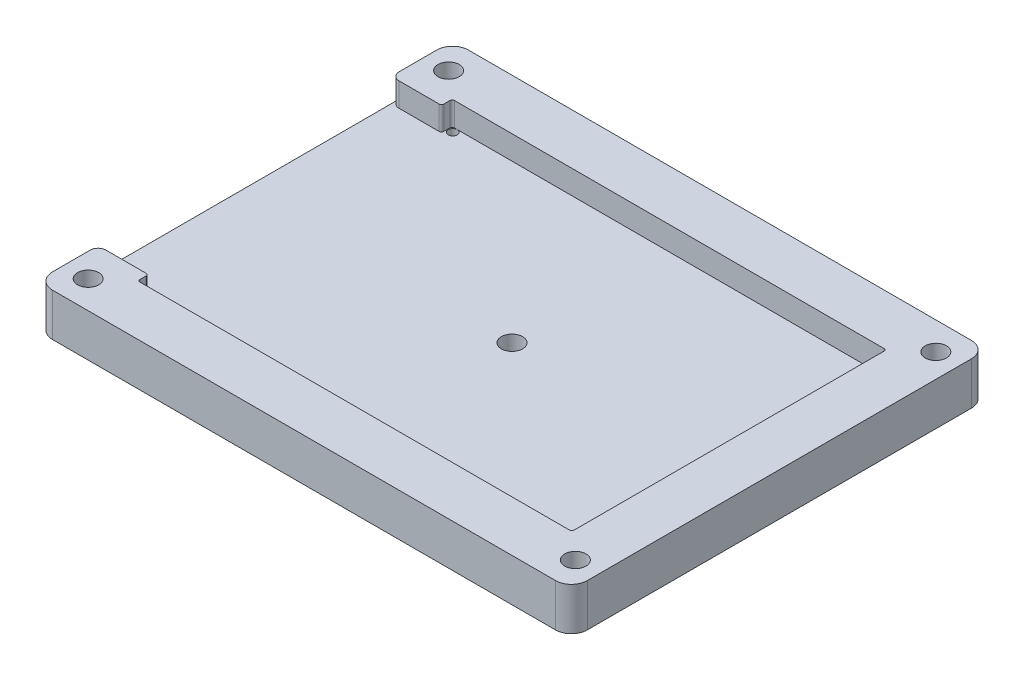
ISO-10303-21;
HEADER;
FILE_DESCRIPTION(('STEP AP214'),'2;1');
FILE_NAME('part.step','',(''),(''),'','','');
FILE_SCHEMA(('AUTOMOTIVE_DESIGN { 1 0 10303 214 1 1 1 1 }'));
ENDSEC;
DATA;
#1=APPLICATION_CONTEXT('core data for automotive mechanical design processes');
#2=APPLICATION_PROTOCOL_DEFINITION('international standard','automotive_design',2000,#1);
#3=PRODUCT_CONTEXT('',#1,'mechanical');
#4=PRODUCT('Part','Part','',(#3));
#5=PRODUCT_RELATED_PRODUCT_CATEGORY('part','',(#4));
#6=PRODUCT_DEFINITION_FORMATION('','',#4);
#7=PRODUCT_DEFINITION_CONTEXT('part definition',#1,'design');
#8=PRODUCT_DEFINITION('design','',#6,#7);
#9=PRODUCT_DEFINITION_SHAPE('','',#8);
#10=(LENGTH_UNIT() NAMED_UNIT(*) SI_UNIT(.MILLI.,.METRE.));
#11=(NAMED_UNIT(*) PLANE_ANGLE_UNIT() SI_UNIT($,.RADIAN.));
#12=(NAMED_UNIT(*) SI_UNIT($,.STERADIAN.) SOLID_ANGLE_UNIT());
#13=UNCERTAINTY_MEASURE_WITH_UNIT(LENGTH_MEASURE(1.E-05),#10,'distance_accuracy_value','');
#14=(GEOMETRIC_REPRESENTATION_CONTEXT(3) GLOBAL_UNCERTAINTY_ASSIGNED_CONTEXT((#13)) GLOBAL_UNIT_ASSIGNED_CONTEXT((#10,
#11,#12)) REPRESENTATION_CONTEXT('',''));
#15=CARTESIAN_POINT('',(0.,0.,0.));
#16=DIRECTION('',(0.,0.,1.));
#17=DIRECTION('',(1.,0.,0.));
#18=AXIS2_PLACEMENT_3D('',#15,#16,#17);
#19=CARTESIAN_POINT('',(-34.798,3.048,25.2095));
#20=DIRECTION('',(-1.,0.,0.));
#21=DIRECTION('',(0.,0.,1.));
#22=AXIS2_PLACEMENT_3D('',#19,#20,#21);
#23=PLANE('',#22);
#24=DIRECTION('',(0.,0.,1.));
#25=VECTOR('',#24,1.);
#26=CARTESIAN_POINT('',(-34.798,6.858,25.2095));
#27=LINE('',#26,#25);
#28=CARTESIAN_POINT('',(-34.798,6.858,-24.8285));
#29=VERTEX_POINT('',#28);
#30=CARTESIAN_POINT('',(-34.798,6.858,-23.876));
#31=VERTEX_POINT('',#30);
#32=EDGE_CURVE('E375',#29,#31,#27,.T.);
#33=ORIENTED_EDGE('',*,*,#32,.T.);
#34=DIRECTION('',(0.,-1.,0.));
#35=VECTOR('',#34,1.);
#36=CARTESIAN_POINT('',(-34.798,3.048,-23.876));
#37=LINE('',#36,#35);
#38=CARTESIAN_POINT('',(-34.798,3.048,-23.876));
#39=VERTEX_POINT('',#38);
#40=EDGE_CURVE('E316',#31,#39,#37,.T.);
#41=ORIENTED_EDGE('',*,*,#40,.T.);
#42=DIRECTION('',(0.,0.,1.));
#43=VECTOR('',#42,1.);
#44=CARTESIAN_POINT('',(-34.798,3.048,25.2095));
#45=LINE('',#44,#43);
#46=CARTESIAN_POINT('',(-34.798,3.048,-24.8285));
#47=VERTEX_POINT('',#46);
#48=EDGE_CURVE('E384',#47,#39,#45,.T.);
#49=ORIENTED_EDGE('',*,*,#48,.F.);
#50=DIRECTION('',(0.,1.,0.));
#51=VECTOR('',#50,1.);
#52=CARTESIAN_POINT('',(-34.798,6.858,-24.8285));
#53=LINE('',#52,#51);
#54=EDGE_CURVE('E291',#47,#29,#53,.T.);
#55=ORIENTED_EDGE('',*,*,#54,.T.);
#56=EDGE_LOOP('',(#33,#41,#49,#55));
#57=FACE_BOUND('',#56,.T.);
#58=ADVANCED_FACE('F37',(#57),#23,.F.);
#59=CARTESIAN_POINT('',(42.8625,6.858,33.3375));
#60=DIRECTION('',(-1.,0.,0.));
#61=DIRECTION('',(0.,0.,1.));
#62=AXIS2_PLACEMENT_3D('',#59,#60,#61);
#63=PLANE('',#62);
#64=DIRECTION('',(0.,0.,-1.));
#65=VECTOR('',#64,1.);
#66=CARTESIAN_POINT('',(42.8625,6.858,33.3375));
#67=LINE('',#66,#65);
#68=CARTESIAN_POINT('',(42.8625,6.858,30.7975));
#69=VERTEX_POINT('',#68);
#70=CARTESIAN_POINT('',(42.8625,6.858,-30.7975));
#71=VERTEX_POINT('',#70);
#72=EDGE_CURVE('E218',#69,#71,#67,.T.);
#73=ORIENTED_EDGE('',*,*,#72,.F.);
#74=DIRECTION('',(0.,-1.,0.));
#75=VECTOR('',#74,1.);
#76=CARTESIAN_POINT('',(42.8625,6.858,30.7975));
#77=LINE('',#76,#75);
#78=CARTESIAN_POINT('',(42.8625,0.,30.7975));
#79=VERTEX_POINT('',#78);
#80=EDGE_CURVE('E202',#69,#79,#77,.T.);
#81=ORIENTED_EDGE('',*,*,#80,.T.);
#82=DIRECTION('',(0.,0.,-1.));
#83=VECTOR('',#82,1.);
#84=CARTESIAN_POINT('',(42.8625,0.,33.3375));
#85=LINE('',#84,#83);
#86=CARTESIAN_POINT('',(42.8625,0.,-30.7975));
#87=VERTEX_POINT('',#86);
#88=EDGE_CURVE('E215',#79,#87,#85,.T.);
#89=ORIENTED_EDGE('',*,*,#88,.T.);
#90=DIRECTION('',(0.,-1.,0.));
#91=VECTOR('',#90,1.);
#92=CARTESIAN_POINT('',(42.8625,6.858,-30.7975));
#93=LINE('',#92,#91);
#94=EDGE_CURVE('E220',#87,#71,#93,.F.);
#95=ORIENTED_EDGE('',*,*,#94,.T.);
#96=EDGE_LOOP('',(#73,#81,#89,#95));
#97=FACE_BOUND('',#96,.T.);
#98=ADVANCED_FACE('F214',(#97),#63,.F.);
#99=CARTESIAN_POINT('',(-42.8625,6.858,-33.3375));
#100=DIRECTION('',(0.,0.,1.));
#101=DIRECTION('',(1.,0.,0.));
#102=AXIS2_PLACEMENT_3D('',#99,#100,#101);
#103=PLANE('',#102);
#104=DIRECTION('',(-1.,0.,0.));
#105=VECTOR('',#104,1.);
#106=CARTESIAN_POINT('',(-42.8625,0.,-33.3375));
#107=LINE('',#106,#105);
#108=CARTESIAN_POINT('',(40.3225,0.,-33.3375));
#109=VERTEX_POINT('',#108);
#110=CARTESIAN_POINT('',(-40.3225,0.,-33.3375));
#111=VERTEX_POINT('',#110);
#112=EDGE_CURVE('E225',#109,#111,#107,.T.);
#113=ORIENTED_EDGE('',*,*,#112,.T.);
#114=DIRECTION('',(0.,-1.,0.));
#115=VECTOR('',#114,1.);
#116=CARTESIAN_POINT('',(-40.3225,6.858,-33.3375));
#117=LINE('',#116,#115);
#118=CARTESIAN_POINT('',(-40.3225,6.858,-33.3375));
#119=VERTEX_POINT('',#118);
#120=EDGE_CURVE('E266',#111,#119,#117,.F.);
#121=ORIENTED_EDGE('',*,*,#120,.T.);
#122=DIRECTION('',(-1.,0.,0.));
#123=VECTOR('',#122,1.);
#124=CARTESIAN_POINT('',(-42.8625,6.858,-33.3375));
#125=LINE('',#124,#123);
#126=CARTESIAN_POINT('',(40.3225,6.858,-33.3375));
#127=VERTEX_POINT('',#126);
#128=EDGE_CURVE('E361',#127,#119,#125,.T.);
#129=ORIENTED_EDGE('',*,*,#128,.F.);
#130=DIRECTION('',(0.,-1.,0.));
#131=VECTOR('',#130,1.);
#132=CARTESIAN_POINT('',(40.3225,6.858,-33.3375));
#133=LINE('',#132,#131);
#134=EDGE_CURVE('E263',#127,#109,#133,.T.);
#135=ORIENTED_EDGE('',*,*,#134,.T.);
#136=EDGE_LOOP('',(#113,#121,#129,#135));
#137=FACE_BOUND('',#136,.T.);
#138=ADVANCED_FACE('F518',(#137),#103,.F.);
#139=CARTESIAN_POINT('',(-42.8625,6.858,33.3375));
#140=DIRECTION('',(1.,0.,0.));
#141=DIRECTION('',(0.,0.,-1.));
#142=AXIS2_PLACEMENT_3D('',#139,#140,#141);
#143=PLANE('',#142);
#144=DIRECTION('',(0.,0.,1.));
#145=VECTOR('',#144,1.);
#146=CARTESIAN_POINT('',(-42.8625,3.048,33.3375));
#147=LINE('',#146,#145);
#148=CARTESIAN_POINT('',(-42.8625,3.048,-24.765));
#149=VERTEX_POINT('',#148);
#150=CARTESIAN_POINT('',(-42.8625,3.048,24.765));
#151=VERTEX_POINT('',#150);
#152=EDGE_CURVE('E344',#149,#151,#147,.T.);
#153=ORIENTED_EDGE('',*,*,#152,.F.);
#154=DIRECTION('',(0.,1.,0.));
#155=VECTOR('',#154,1.);
#156=CARTESIAN_POINT('',(-42.8625,6.858,-24.765));
#157=LINE('',#156,#155);
#158=CARTESIAN_POINT('',(-42.8625,6.858,-24.765));
#159=VERTEX_POINT('',#158);
#160=EDGE_CURVE('E329',#149,#159,#157,.T.);
#161=ORIENTED_EDGE('',*,*,#160,.T.);
#162=DIRECTION('',(0.,0.,1.));
#163=VECTOR('',#162,1.);
#164=CARTESIAN_POINT('',(-42.8625,6.858,33.3375));
#165=LINE('',#164,#163);
#166=CARTESIAN_POINT('',(-42.8625,6.858,-30.7975));
#167=VERTEX_POINT('',#166);
#168=EDGE_CURVE('E352',#167,#159,#165,.T.);
#169=ORIENTED_EDGE('',*,*,#168,.F.);
#170=DIRECTION('',(0.,-1.,0.));
#171=VECTOR('',#170,1.);
#172=CARTESIAN_POINT('',(-42.8625,6.858,-30.7975));
#173=LINE('',#172,#171);
#174=CARTESIAN_POINT('',(-42.8625,0.,-30.7975));
#175=VERTEX_POINT('',#174);
#176=EDGE_CURVE('E260',#167,#175,#173,.T.);
#177=ORIENTED_EDGE('',*,*,#176,.T.);
#178=DIRECTION('',(0.,0.,1.));
#179=VECTOR('',#178,1.);
#180=CARTESIAN_POINT('',(-42.8625,0.,33.3375));
#181=LINE('',#180,#179);
#182=CARTESIAN_POINT('',(-42.8625,0.,30.7975));
#183=VERTEX_POINT('',#182);
#184=EDGE_CURVE('E229',#175,#183,#181,.T.);
#185=ORIENTED_EDGE('',*,*,#184,.T.);
#186=DIRECTION('',(0.,-1.,0.));
#187=VECTOR('',#186,1.);
#188=CARTESIAN_POINT('',(-42.8625,6.858,30.7975));
#189=LINE('',#188,#187);
#190=CARTESIAN_POINT('',(-42.8625,6.858,30.7975));
#191=VERTEX_POINT('',#190);
#192=EDGE_CURVE('E257',#183,#191,#189,.F.);
#193=ORIENTED_EDGE('',*,*,#192,.T.);
#194=CARTESIAN_POINT('',(-42.8625,6.858,24.765));
#195=VERTEX_POINT('',#194);
#196=EDGE_CURVE('E359',#195,#191,#165,.T.);
#197=ORIENTED_EDGE('',*,*,#196,.F.);
#198=DIRECTION('',(0.,-1.,0.));
#199=VECTOR('',#198,1.);
#200=CARTESIAN_POINT('',(-42.8625,6.858,24.765));
#201=LINE('',#200,#199);
#202=EDGE_CURVE('E326',#195,#151,#201,.T.);
#203=ORIENTED_EDGE('',*,*,#202,.T.);
#204=EDGE_LOOP('',(#153,#161,#169,#177,#185,#193,#197,#203));
#205=FACE_BOUND('',#204,.T.);
#206=ADVANCED_FACE('F351',(#205),#143,.F.);
#207=CARTESIAN_POINT('',(-42.8625,6.858,33.3375));
#208=DIRECTION('',(0.,0.,-1.));
#209=DIRECTION('',(-1.,0.,0.));
#210=AXIS2_PLACEMENT_3D('',#207,#208,#209);
#211=PLANE('',#210);
#212=DIRECTION('',(1.,0.,0.));
#213=VECTOR('',#212,1.);
#214=CARTESIAN_POINT('',(-42.8625,0.,33.3375));
#215=LINE('',#214,#213);
#216=CARTESIAN_POINT('',(-40.3225,0.,33.3375));
#217=VERTEX_POINT('',#216);
#218=CARTESIAN_POINT('',(40.3225,0.,33.3375));
#219=VERTEX_POINT('',#218);
#220=EDGE_CURVE('E240',#217,#219,#215,.T.);
#221=ORIENTED_EDGE('',*,*,#220,.T.);
#222=DIRECTION('',(0.,-1.,0.));
#223=VECTOR('',#222,1.);
#224=CARTESIAN_POINT('',(40.3225,6.858,33.3375));
#225=LINE('',#224,#223);
#226=CARTESIAN_POINT('',(40.3225,6.858,33.3375));
#227=VERTEX_POINT('',#226);
#228=EDGE_CURVE('E203',#219,#227,#225,.F.);
#229=ORIENTED_EDGE('',*,*,#228,.T.);
#230=DIRECTION('',(1.,0.,0.));
#231=VECTOR('',#230,1.);
#232=CARTESIAN_POINT('',(-42.8625,6.858,33.3375));
#233=LINE('',#232,#231);
#234=CARTESIAN_POINT('',(-40.3225,6.858,33.3375));
#235=VERTEX_POINT('',#234);
#236=EDGE_CURVE('E235',#235,#227,#233,.T.);
#237=ORIENTED_EDGE('',*,*,#236,.F.);
#238=DIRECTION('',(0.,-1.,0.));
#239=VECTOR('',#238,1.);
#240=CARTESIAN_POINT('',(-40.3225,6.858,33.3375));
#241=LINE('',#240,#239);
#242=EDGE_CURVE('E208',#235,#217,#241,.T.);
#243=ORIENTED_EDGE('',*,*,#242,.T.);
#244=EDGE_LOOP('',(#221,#229,#237,#243));
#245=FACE_BOUND('',#244,.T.);
#246=ADVANCED_FACE('F511',(#245),#211,.F.);
#247=CARTESIAN_POINT('',(0.,6.858,0.));
#248=DIRECTION('',(0.,-1.,0.));
#249=DIRECTION('',(0.,0.,-1.));
#250=AXIS2_PLACEMENT_3D('',#247,#248,#249);
#251=PLANE('',#250);
#252=CARTESIAN_POINT('',(39.0525,6.858,-28.8925));
#253=DIRECTION('',(0.,-1.,0.));
#254=DIRECTION('',(0.,0.,-1.));
#255=AXIS2_PLACEMENT_3D('',#252,#253,#254);
#256=CIRCLE('',#255,1.7);
#257=CARTESIAN_POINT('',(39.0525,6.858,-30.5925));
#258=VERTEX_POINT('',#257);
#259=EDGE_CURVE('E434',#258,#258,#256,.T.);
#260=ORIENTED_EDGE('',*,*,#259,.T.);
#261=EDGE_LOOP('',(#260));
#262=FACE_BOUND('',#261,.T.);
#263=CARTESIAN_POINT('',(-39.0525,6.858,-28.8925));
#264=DIRECTION('',(0.,-1.,0.));
#265=DIRECTION('',(0.,0.,-1.));
#266=AXIS2_PLACEMENT_3D('',#263,#264,#265);
#267=CIRCLE('',#266,1.7);
#268=CARTESIAN_POINT('',(-39.0525,6.858,-30.5925));
#269=VERTEX_POINT('',#268);
#270=EDGE_CURVE('E422',#269,#269,#267,.T.);
#271=ORIENTED_EDGE('',*,*,#270,.T.);
#272=EDGE_LOOP('',(#271));
#273=FACE_BOUND('',#272,.T.);
#274=CARTESIAN_POINT('',(39.0525,6.858,28.8925));
#275=DIRECTION('',(0.,-1.,0.));
#276=DIRECTION('',(0.,0.,-1.));
#277=AXIS2_PLACEMENT_3D('',#274,#275,#276);
#278=CIRCLE('',#277,1.7);
#279=CARTESIAN_POINT('',(39.0525,6.858,27.1925));
#280=VERTEX_POINT('',#279);
#281=EDGE_CURVE('E416',#280,#280,#278,.T.);
#282=ORIENTED_EDGE('',*,*,#281,.T.);
#283=EDGE_LOOP('',(#282));
#284=FACE_BOUND('',#283,.T.);
#285=CARTESIAN_POINT('',(-39.0525,6.858,28.8925));
#286=DIRECTION('',(0.,-1.,0.));
#287=DIRECTION('',(0.,0.,-1.));
#288=AXIS2_PLACEMENT_3D('',#285,#286,#287);
#289=CIRCLE('',#288,1.7);
#290=CARTESIAN_POINT('',(-39.0525,6.858,27.1925));
#291=VERTEX_POINT('',#290);
#292=EDGE_CURVE('E406',#291,#291,#289,.T.);
#293=ORIENTED_EDGE('',*,*,#292,.T.);
#294=EDGE_LOOP('',(#293));
#295=FACE_BOUND('',#294,.T.);
#296=ORIENTED_EDGE('',*,*,#168,.T.);
#297=CARTESIAN_POINT('',(-41.5925,6.858,-24.765));
#298=DIRECTION('',(0.,-1.,0.));
#299=DIRECTION('',(0.,0.,-1.));
#300=AXIS2_PLACEMENT_3D('',#297,#298,#299);
#301=CIRCLE('',#300,1.27);
#302=CARTESIAN_POINT('',(-41.5925,6.858,-23.495));
#303=VERTEX_POINT('',#302);
#304=EDGE_CURVE('E334',#159,#303,#301,.F.);
#305=ORIENTED_EDGE('',*,*,#304,.T.);
#306=DIRECTION('',(-1.,0.,0.));
#307=VECTOR('',#306,1.);
#308=CARTESIAN_POINT('',(-66.0615819385217,6.858,-23.495));
#309=LINE('',#308,#307);
#310=CARTESIAN_POINT('',(-35.179,6.858,-23.495));
#311=VERTEX_POINT('',#310);
#312=EDGE_CURVE('E443',#311,#303,#309,.T.);
#313=ORIENTED_EDGE('',*,*,#312,.F.);
#314=CARTESIAN_POINT('',(-35.179,6.858,-23.876));
#315=DIRECTION('',(0.,-1.,0.));
#316=DIRECTION('',(0.,0.,-1.));
#317=AXIS2_PLACEMENT_3D('',#314,#315,#316);
#318=CIRCLE('',#317,0.381);
#319=EDGE_CURVE('E309',#311,#31,#318,.F.);
#320=ORIENTED_EDGE('',*,*,#319,.T.);
#321=ORIENTED_EDGE('',*,*,#32,.F.);
#322=CARTESIAN_POINT('',(-34.417,6.858,-24.8285));
#323=DIRECTION('',(0.,-1.,0.));
#324=DIRECTION('',(0.,0.,-1.));
#325=AXIS2_PLACEMENT_3D('',#322,#323,#324);
#326=CIRCLE('',#325,0.381);
#327=CARTESIAN_POINT('',(-34.417,6.858,-25.2095));
#328=VERTEX_POINT('',#327);
#329=EDGE_CURVE('E304',#29,#328,#326,.T.);
#330=ORIENTED_EDGE('',*,*,#329,.T.);
#331=DIRECTION('',(-1.,0.,0.));
#332=VECTOR('',#331,1.);
#333=CARTESIAN_POINT('',(34.798,6.858,-25.2095));
#334=LINE('',#333,#332);
#335=CARTESIAN_POINT('',(34.417,6.858,-25.2095));
#336=VERTEX_POINT('',#335);
#337=EDGE_CURVE('E365',#336,#328,#334,.T.);
#338=ORIENTED_EDGE('',*,*,#337,.F.);
#339=CARTESIAN_POINT('',(34.417,6.858,-24.8285));
#340=DIRECTION('',(0.,-1.,0.));
#341=DIRECTION('',(0.,0.,-1.));
#342=AXIS2_PLACEMENT_3D('',#339,#340,#341);
#343=CIRCLE('',#342,0.381);
#344=CARTESIAN_POINT('',(34.798,6.858,-24.8285));
#345=VERTEX_POINT('',#344);
#346=EDGE_CURVE('E299',#336,#345,#343,.T.);
#347=ORIENTED_EDGE('',*,*,#346,.T.);
#348=DIRECTION('',(0.,0.,-1.));
#349=VECTOR('',#348,1.);
#350=CARTESIAN_POINT('',(34.798,6.858,25.2095));
#351=LINE('',#350,#349);
#352=CARTESIAN_POINT('',(34.798,6.858,24.8285));
#353=VERTEX_POINT('',#352);
#354=EDGE_CURVE('E369',#353,#345,#351,.T.);
#355=ORIENTED_EDGE('',*,*,#354,.F.);
#356=CARTESIAN_POINT('',(34.417,6.858,24.8285));
#357=DIRECTION('',(0.,-1.,0.));
#358=DIRECTION('',(0.,0.,-1.));
#359=AXIS2_PLACEMENT_3D('',#356,#357,#358);
#360=CIRCLE('',#359,0.381);
#361=CARTESIAN_POINT('',(34.417,6.858,25.2095));
#362=VERTEX_POINT('',#361);
#363=EDGE_CURVE('E297',#353,#362,#360,.T.);
#364=ORIENTED_EDGE('',*,*,#363,.T.);
#365=DIRECTION('',(1.,0.,0.));
#366=VECTOR('',#365,1.);
#367=CARTESIAN_POINT('',(34.798,6.858,25.2095));
#368=LINE('',#367,#366);
#369=CARTESIAN_POINT('',(-34.417,6.858,25.2095));
#370=VERTEX_POINT('',#369);
#371=EDGE_CURVE('E372',#370,#362,#368,.T.);
#372=ORIENTED_EDGE('',*,*,#371,.F.);
#373=CARTESIAN_POINT('',(-34.417,6.858,24.8285));
#374=DIRECTION('',(0.,-1.,0.));
#375=DIRECTION('',(0.,0.,-1.));
#376=AXIS2_PLACEMENT_3D('',#373,#374,#375);
#377=CIRCLE('',#376,0.381);
#378=CARTESIAN_POINT('',(-34.798,6.858,24.8285));
#379=VERTEX_POINT('',#378);
#380=EDGE_CURVE('E301',#370,#379,#377,.T.);
#381=ORIENTED_EDGE('',*,*,#380,.T.);
#382=CARTESIAN_POINT('',(-34.798,6.858,23.876));
#383=VERTEX_POINT('',#382);
#384=EDGE_CURVE('E377',#383,#379,#27,.T.);
#385=ORIENTED_EDGE('',*,*,#384,.F.);
#386=CARTESIAN_POINT('',(-35.179,6.858,23.876));
#387=DIRECTION('',(0.,-1.,0.));
#388=DIRECTION('',(0.,0.,-1.));
#389=AXIS2_PLACEMENT_3D('',#386,#387,#388);
#390=CIRCLE('',#389,0.381);
#391=CARTESIAN_POINT('',(-35.179,6.858,23.495));
#392=VERTEX_POINT('',#391);
#393=EDGE_CURVE('E311',#383,#392,#390,.F.);
#394=ORIENTED_EDGE('',*,*,#393,.T.);
#395=DIRECTION('',(1.,0.,0.));
#396=VECTOR('',#395,1.);
#397=CARTESIAN_POINT('',(-66.0615819385217,6.858,23.495));
#398=LINE('',#397,#396);
#399=CARTESIAN_POINT('',(-41.5925,6.858,23.495));
#400=VERTEX_POINT('',#399);
#401=EDGE_CURVE('E445',#400,#392,#398,.T.);
#402=ORIENTED_EDGE('',*,*,#401,.F.);
#403=CARTESIAN_POINT('',(-41.5925,6.858,24.765));
#404=DIRECTION('',(0.,-1.,0.));
#405=DIRECTION('',(0.,0.,-1.));
#406=AXIS2_PLACEMENT_3D('',#403,#404,#405);
#407=CIRCLE('',#406,1.27);
#408=EDGE_CURVE('E332',#400,#195,#407,.F.);
#409=ORIENTED_EDGE('',*,*,#408,.T.);
#410=ORIENTED_EDGE('',*,*,#196,.T.);
#411=CARTESIAN_POINT('',(-40.3225,6.858,30.7975));
#412=DIRECTION('',(0.,-1.,0.));
#413=DIRECTION('',(0.,0.,-1.));
#414=AXIS2_PLACEMENT_3D('',#411,#412,#413);
#415=CIRCLE('',#414,2.54);
#416=EDGE_CURVE('E249',#191,#235,#415,.F.);
#417=ORIENTED_EDGE('',*,*,#416,.T.);
#418=ORIENTED_EDGE('',*,*,#236,.T.);
#419=CARTESIAN_POINT('',(40.3225,6.858,30.7975));
#420=DIRECTION('',(0.,-1.,0.));
#421=DIRECTION('',(0.,0.,-1.));
#422=AXIS2_PLACEMENT_3D('',#419,#420,#421);
#423=CIRCLE('',#422,2.54);
#424=EDGE_CURVE('E255',#227,#69,#423,.F.);
#425=ORIENTED_EDGE('',*,*,#424,.T.);
#426=ORIENTED_EDGE('',*,*,#72,.T.);
#427=CARTESIAN_POINT('',(40.3225,6.858,-30.7975));
#428=DIRECTION('',(0.,-1.,0.));
#429=DIRECTION('',(0.,0.,-1.));
#430=AXIS2_PLACEMENT_3D('',#427,#428,#429);
#431=CIRCLE('',#430,2.54);
#432=EDGE_CURVE('E251',#71,#127,#431,.F.);
#433=ORIENTED_EDGE('',*,*,#432,.T.);
#434=ORIENTED_EDGE('',*,*,#128,.T.);
#435=CARTESIAN_POINT('',(-40.3225,6.858,-30.7975));
#436=DIRECTION('',(0.,-1.,0.));
#437=DIRECTION('',(0.,0.,-1.));
#438=AXIS2_PLACEMENT_3D('',#435,#436,#437);
#439=CIRCLE('',#438,2.54);
#440=EDGE_CURVE('E253',#119,#167,#439,.F.);
#441=ORIENTED_EDGE('',*,*,#440,.T.);
#442=EDGE_LOOP('',(#296,#305,#313,#320,#321,#330,#338,#347,#355,#364,#372,#381,#385,#394,#402,
#409,#410,#417,#418,#425,#426,#433,#434,#441));
#443=FACE_BOUND('',#442,.T.);
#444=ADVANCED_FACE('F355',(#262,#273,#284,#295,#443),#251,.F.);
#445=CARTESIAN_POINT('',(0.,0.,0.));
#446=DIRECTION('',(0.,-1.,0.));
#447=DIRECTION('',(0.,0.,-1.));
#448=AXIS2_PLACEMENT_3D('',#445,#446,#447);
#449=PLANE('',#448);
#450=CARTESIAN_POINT('',(39.0525,0.,-28.8925));
#451=DIRECTION('',(0.,-1.,0.));
#452=DIRECTION('',(0.,0.,-1.));
#453=AXIS2_PLACEMENT_3D('',#450,#451,#452);
#454=CIRCLE('',#453,1.7);
#455=CARTESIAN_POINT('',(39.0525,0.,-30.5925));
#456=VERTEX_POINT('',#455);
#457=EDGE_CURVE('E437',#456,#456,#454,.T.);
#458=ORIENTED_EDGE('',*,*,#457,.F.);
#459=EDGE_LOOP('',(#458));
#460=FACE_BOUND('',#459,.T.);
#461=CARTESIAN_POINT('',(0.,0.,0.));
#462=DIRECTION('',(0.,-1.,0.));
#463=DIRECTION('',(0.,0.,-1.));
#464=AXIS2_PLACEMENT_3D('',#461,#462,#463);
#465=CIRCLE('',#464,1.7);
#466=CARTESIAN_POINT('',(0.,0.,-1.7));
#467=VERTEX_POINT('',#466);
#468=EDGE_CURVE('E431',#467,#467,#465,.T.);
#469=ORIENTED_EDGE('',*,*,#468,.F.);
#470=EDGE_LOOP('',(#469));
#471=FACE_BOUND('',#470,.T.);
#472=CARTESIAN_POINT('',(-39.0525,0.,-28.8925));
#473=DIRECTION('',(0.,-1.,0.));
#474=DIRECTION('',(0.,0.,-1.));
#475=AXIS2_PLACEMENT_3D('',#472,#473,#474);
#476=CIRCLE('',#475,1.7);
#477=CARTESIAN_POINT('',(-39.0525,0.,-30.5925));
#478=VERTEX_POINT('',#477);
#479=EDGE_CURVE('E425',#478,#478,#476,.T.);
#480=ORIENTED_EDGE('',*,*,#479,.F.);
#481=EDGE_LOOP('',(#480));
#482=FACE_BOUND('',#481,.T.);
#483=CARTESIAN_POINT('',(39.0525,0.,28.8925));
#484=DIRECTION('',(0.,-1.,0.));
#485=DIRECTION('',(0.,0.,-1.));
#486=AXIS2_PLACEMENT_3D('',#483,#484,#485);
#487=CIRCLE('',#486,1.7);
#488=CARTESIAN_POINT('',(39.0525,0.,27.1925));
#489=VERTEX_POINT('',#488);
#490=EDGE_CURVE('E419',#489,#489,#487,.T.);
#491=ORIENTED_EDGE('',*,*,#490,.F.);
#492=EDGE_LOOP('',(#491));
#493=FACE_BOUND('',#492,.T.);
#494=CARTESIAN_POINT('',(-39.0525,0.,28.8925));
#495=DIRECTION('',(0.,-1.,0.));
#496=DIRECTION('',(0.,0.,-1.));
#497=AXIS2_PLACEMENT_3D('',#494,#495,#496);
#498=CIRCLE('',#497,1.7);
#499=CARTESIAN_POINT('',(-39.0525,0.,27.1925));
#500=VERTEX_POINT('',#499);
#501=EDGE_CURVE('E413',#500,#500,#498,.T.);
#502=ORIENTED_EDGE('',*,*,#501,.F.);
#503=EDGE_LOOP('',(#502));
#504=FACE_BOUND('',#503,.T.);
#505=CARTESIAN_POINT('',(-33.9725,0.,24.4729));
#506=DIRECTION('',(0.,-1.,0.));
#507=DIRECTION('',(0.,0.,-1.));
#508=AXIS2_PLACEMENT_3D('',#505,#506,#507);
#509=CIRCLE('',#508,0.723899999999999);
#510=CARTESIAN_POINT('',(-33.9725,0.,23.749));
#511=VERTEX_POINT('',#510);
#512=EDGE_CURVE('E386',#511,#511,#509,.T.);
#513=ORIENTED_EDGE('',*,*,#512,.F.);
#514=EDGE_LOOP('',(#513));
#515=FACE_BOUND('',#514,.T.);
#516=CARTESIAN_POINT('',(33.9725,0.,24.4729));
#517=DIRECTION('',(0.,-1.,0.));
#518=DIRECTION('',(0.,0.,-1.));
#519=AXIS2_PLACEMENT_3D('',#516,#517,#518);
#520=CIRCLE('',#519,0.723899999999999);
#521=CARTESIAN_POINT('',(33.9725,0.,23.749));
#522=VERTEX_POINT('',#521);
#523=EDGE_CURVE('E389',#522,#522,#520,.T.);
#524=ORIENTED_EDGE('',*,*,#523,.F.);
#525=EDGE_LOOP('',(#524));
#526=FACE_BOUND('',#525,.T.);
#527=CARTESIAN_POINT('',(33.9725,0.,-24.4729));
#528=DIRECTION('',(0.,-1.,0.));
#529=DIRECTION('',(0.,0.,-1.));
#530=AXIS2_PLACEMENT_3D('',#527,#528,#529);
#531=CIRCLE('',#530,0.723899999999999);
#532=CARTESIAN_POINT('',(33.9725,0.,-25.1968));
#533=VERTEX_POINT('',#532);
#534=EDGE_CURVE('E392',#533,#533,#531,.T.);
#535=ORIENTED_EDGE('',*,*,#534,.F.);
#536=EDGE_LOOP('',(#535));
#537=FACE_BOUND('',#536,.T.);
#538=CARTESIAN_POINT('',(-33.9725,0.,-24.4729));
#539=DIRECTION('',(0.,-1.,0.));
#540=DIRECTION('',(0.,0.,-1.));
#541=AXIS2_PLACEMENT_3D('',#538,#539,#540);
#542=CIRCLE('',#541,0.723899999999999);
#543=CARTESIAN_POINT('',(-33.9725,0.,-25.1968));
#544=VERTEX_POINT('',#543);
#545=EDGE_CURVE('E395',#544,#544,#542,.T.);
#546=ORIENTED_EDGE('',*,*,#545,.F.);
#547=EDGE_LOOP('',(#546));
#548=FACE_BOUND('',#547,.T.);
#549=ORIENTED_EDGE('',*,*,#88,.F.);
#550=CARTESIAN_POINT('',(40.3225,0.,30.7975));
#551=DIRECTION('',(0.,-1.,0.));
#552=DIRECTION('',(0.,0.,-1.));
#553=AXIS2_PLACEMENT_3D('',#550,#551,#552);
#554=CIRCLE('',#553,2.54);
#555=EDGE_CURVE('E198',#79,#219,#554,.T.);
#556=ORIENTED_EDGE('',*,*,#555,.T.);
#557=ORIENTED_EDGE('',*,*,#220,.F.);
#558=CARTESIAN_POINT('',(-40.3225,0.,30.7975));
#559=DIRECTION('',(0.,-1.,0.));
#560=DIRECTION('',(0.,0.,-1.));
#561=AXIS2_PLACEMENT_3D('',#558,#559,#560);
#562=CIRCLE('',#561,2.54);
#563=EDGE_CURVE('E219',#217,#183,#562,.T.);
#564=ORIENTED_EDGE('',*,*,#563,.T.);
#565=ORIENTED_EDGE('',*,*,#184,.F.);
#566=CARTESIAN_POINT('',(-40.3225,0.,-30.7975));
#567=DIRECTION('',(0.,-1.,0.));
#568=DIRECTION('',(0.,0.,-1.));
#569=AXIS2_PLACEMENT_3D('',#566,#567,#568);
#570=CIRCLE('',#569,2.54);
#571=EDGE_CURVE('E209',#175,#111,#570,.T.);
#572=ORIENTED_EDGE('',*,*,#571,.T.);
#573=ORIENTED_EDGE('',*,*,#112,.F.);
#574=CARTESIAN_POINT('',(40.3225,0.,-30.7975));
#575=DIRECTION('',(0.,-1.,0.));
#576=DIRECTION('',(0.,0.,-1.));
#577=AXIS2_PLACEMENT_3D('',#574,#575,#576);
#578=CIRCLE('',#577,2.54);
#579=EDGE_CURVE('E224',#109,#87,#578,.T.);
#580=ORIENTED_EDGE('',*,*,#579,.T.);
#581=EDGE_LOOP('',(#549,#556,#557,#564,#565,#572,#573,#580));
#582=FACE_BOUND('',#581,.T.);
#583=ADVANCED_FACE('F222',(#460,#471,#482,#493,#504,#515,#526,#537,#548,#582),#449,.T.);
#584=CARTESIAN_POINT('',(40.3225,6.858,30.7975));
#585=DIRECTION('',(0.,-1.,0.));
#586=DIRECTION('',(0.,0.,-1.));
#587=AXIS2_PLACEMENT_3D('',#584,#585,#586);
#588=CYLINDRICAL_SURFACE('',#587,2.54);
#589=ORIENTED_EDGE('',*,*,#424,.F.);
#590=ORIENTED_EDGE('',*,*,#228,.F.);
#591=ORIENTED_EDGE('',*,*,#555,.F.);
#592=ORIENTED_EDGE('',*,*,#80,.F.);
#593=EDGE_LOOP('',(#589,#590,#591,#592));
#594=FACE_BOUND('',#593,.T.);
#595=ADVANCED_FACE('F201',(#594),#588,.T.);
#596=CARTESIAN_POINT('',(-40.3225,6.858,-30.7975));
#597=DIRECTION('',(0.,-1.,0.));
#598=DIRECTION('',(0.,0.,-1.));
#599=AXIS2_PLACEMENT_3D('',#596,#597,#598);
#600=CYLINDRICAL_SURFACE('',#599,2.54);
#601=ORIENTED_EDGE('',*,*,#440,.F.);
#602=ORIENTED_EDGE('',*,*,#120,.F.);
#603=ORIENTED_EDGE('',*,*,#571,.F.);
#604=ORIENTED_EDGE('',*,*,#176,.F.);
#605=EDGE_LOOP('',(#601,#602,#603,#604));
#606=FACE_BOUND('',#605,.T.);
#607=ADVANCED_FACE('F515',(#606),#600,.T.);
#608=CARTESIAN_POINT('',(40.3225,6.858,-30.7975));
#609=DIRECTION('',(0.,-1.,0.));
#610=DIRECTION('',(0.,0.,-1.));
#611=AXIS2_PLACEMENT_3D('',#608,#609,#610);
#612=CYLINDRICAL_SURFACE('',#611,2.54);
#613=ORIENTED_EDGE('',*,*,#432,.F.);
#614=ORIENTED_EDGE('',*,*,#94,.F.);
#615=ORIENTED_EDGE('',*,*,#579,.F.);
#616=ORIENTED_EDGE('',*,*,#134,.F.);
#617=EDGE_LOOP('',(#613,#614,#615,#616));
#618=FACE_BOUND('',#617,.T.);
#619=ADVANCED_FACE('F523',(#618),#612,.T.);
#620=CARTESIAN_POINT('',(-40.3225,6.858,30.7975));
#621=DIRECTION('',(0.,-1.,0.));
#622=DIRECTION('',(0.,0.,-1.));
#623=AXIS2_PLACEMENT_3D('',#620,#621,#622);
#624=CYLINDRICAL_SURFACE('',#623,2.54);
#625=ORIENTED_EDGE('',*,*,#416,.F.);
#626=ORIENTED_EDGE('',*,*,#192,.F.);
#627=ORIENTED_EDGE('',*,*,#563,.F.);
#628=ORIENTED_EDGE('',*,*,#242,.F.);
#629=EDGE_LOOP('',(#625,#626,#627,#628));
#630=FACE_BOUND('',#629,.T.);
#631=ADVANCED_FACE('F512',(#630),#624,.T.);
#632=CARTESIAN_POINT('',(-34.798,3.048,23.876));
#633=VERTEX_POINT('',#632);
#634=CARTESIAN_POINT('',(-34.798,3.048,24.8285));
#635=VERTEX_POINT('',#634);
#636=EDGE_CURVE('E368',#633,#635,#45,.T.);
#637=ORIENTED_EDGE('',*,*,#636,.F.);
#638=DIRECTION('',(0.,1.,0.));
#639=VECTOR('',#638,1.);
#640=CARTESIAN_POINT('',(-34.798,3.048,23.876));
#641=LINE('',#640,#639);
#642=EDGE_CURVE('E306',#633,#383,#641,.T.);
#643=ORIENTED_EDGE('',*,*,#642,.T.);
#644=ORIENTED_EDGE('',*,*,#384,.T.);
#645=DIRECTION('',(0.,1.,0.));
#646=VECTOR('',#645,1.);
#647=CARTESIAN_POINT('',(-34.798,3.048,24.8285));
#648=LINE('',#647,#646);
#649=EDGE_CURVE('E294',#379,#635,#648,.F.);
#650=ORIENTED_EDGE('',*,*,#649,.T.);
#651=EDGE_LOOP('',(#637,#643,#644,#650));
#652=FACE_BOUND('',#651,.T.);
#653=ADVANCED_FACE('F493',(#652),#23,.F.);
#654=CARTESIAN_POINT('',(34.798,3.048,-25.2095));
#655=DIRECTION('',(0.,0.,-1.));
#656=DIRECTION('',(-1.,0.,0.));
#657=AXIS2_PLACEMENT_3D('',#654,#655,#656);
#658=PLANE('',#657);
#659=DIRECTION('',(-1.,0.,0.));
#660=VECTOR('',#659,1.);
#661=CARTESIAN_POINT('',(34.798,3.048,-25.2095));
#662=LINE('',#661,#660);
#663=CARTESIAN_POINT('',(34.417,3.048,-25.2095));
#664=VERTEX_POINT('',#663);
#665=CARTESIAN_POINT('',(-34.417,3.048,-25.2095));
#666=VERTEX_POINT('',#665);
#667=EDGE_CURVE('E226',#664,#666,#662,.T.);
#668=ORIENTED_EDGE('',*,*,#667,.F.);
#669=DIRECTION('',(0.,1.,0.));
#670=VECTOR('',#669,1.);
#671=CARTESIAN_POINT('',(34.417,6.858,-25.2095));
#672=LINE('',#671,#670);
#673=EDGE_CURVE('E288',#664,#336,#672,.T.);
#674=ORIENTED_EDGE('',*,*,#673,.T.);
#675=ORIENTED_EDGE('',*,*,#337,.T.);
#676=DIRECTION('',(0.,1.,0.));
#677=VECTOR('',#676,1.);
#678=CARTESIAN_POINT('',(-34.417,3.048,-25.2095));
#679=LINE('',#678,#677);
#680=EDGE_CURVE('E286',#328,#666,#679,.F.);
#681=ORIENTED_EDGE('',*,*,#680,.T.);
#682=EDGE_LOOP('',(#668,#674,#675,#681));
#683=FACE_BOUND('',#682,.T.);
#684=ADVANCED_FACE('F464',(#683),#658,.F.);
#685=CARTESIAN_POINT('',(34.798,3.048,25.2095));
#686=DIRECTION('',(1.,0.,0.));
#687=DIRECTION('',(0.,0.,-1.));
#688=AXIS2_PLACEMENT_3D('',#685,#686,#687);
#689=PLANE('',#688);
#690=DIRECTION('',(0.,0.,-1.));
#691=VECTOR('',#690,1.);
#692=CARTESIAN_POINT('',(34.798,3.048,25.2095));
#693=LINE('',#692,#691);
#694=CARTESIAN_POINT('',(34.798,3.048,24.8285));
#695=VERTEX_POINT('',#694);
#696=CARTESIAN_POINT('',(34.798,3.048,-24.8285));
#697=VERTEX_POINT('',#696);
#698=EDGE_CURVE('E232',#695,#697,#693,.T.);
#699=ORIENTED_EDGE('',*,*,#698,.F.);
#700=DIRECTION('',(0.,1.,0.));
#701=VECTOR('',#700,1.);
#702=CARTESIAN_POINT('',(34.798,6.858,24.8285));
#703=LINE('',#702,#701);
#704=EDGE_CURVE('E270',#695,#353,#703,.T.);
#705=ORIENTED_EDGE('',*,*,#704,.T.);
#706=ORIENTED_EDGE('',*,*,#354,.T.);
#707=DIRECTION('',(0.,1.,0.));
#708=VECTOR('',#707,1.);
#709=CARTESIAN_POINT('',(34.798,3.048,-24.8285));
#710=LINE('',#709,#708);
#711=EDGE_CURVE('E268',#345,#697,#710,.F.);
#712=ORIENTED_EDGE('',*,*,#711,.T.);
#713=EDGE_LOOP('',(#699,#705,#706,#712));
#714=FACE_BOUND('',#713,.T.);
#715=ADVANCED_FACE('F473',(#714),#689,.F.);
#716=CARTESIAN_POINT('',(34.798,3.048,25.2095));
#717=DIRECTION('',(0.,0.,1.));
#718=DIRECTION('',(1.,0.,0.));
#719=AXIS2_PLACEMENT_3D('',#716,#717,#718);
#720=PLANE('',#719);
#721=ORIENTED_EDGE('',*,*,#371,.T.);
#722=DIRECTION('',(0.,1.,0.));
#723=VECTOR('',#722,1.);
#724=CARTESIAN_POINT('',(34.417,3.048,25.2095));
#725=LINE('',#724,#723);
#726=CARTESIAN_POINT('',(34.417,3.048,25.2095));
#727=VERTEX_POINT('',#726);
#728=EDGE_CURVE('E276',#362,#727,#725,.F.);
#729=ORIENTED_EDGE('',*,*,#728,.T.);
#730=DIRECTION('',(1.,0.,0.));
#731=VECTOR('',#730,1.);
#732=CARTESIAN_POINT('',(34.798,3.048,25.2095));
#733=LINE('',#732,#731);
#734=CARTESIAN_POINT('',(-34.417,3.048,25.2095));
#735=VERTEX_POINT('',#734);
#736=EDGE_CURVE('E381',#735,#727,#733,.T.);
#737=ORIENTED_EDGE('',*,*,#736,.F.);
#738=DIRECTION('',(0.,1.,0.));
#739=VECTOR('',#738,1.);
#740=CARTESIAN_POINT('',(-34.417,6.858,25.2095));
#741=LINE('',#740,#739);
#742=EDGE_CURVE('E273',#735,#370,#741,.T.);
#743=ORIENTED_EDGE('',*,*,#742,.T.);
#744=EDGE_LOOP('',(#721,#729,#737,#743));
#745=FACE_BOUND('',#744,.T.);
#746=ADVANCED_FACE('F481',(#745),#720,.F.);
#747=CARTESIAN_POINT('',(0.,3.048,0.));
#748=DIRECTION('',(0.,1.,0.));
#749=DIRECTION('',(0.,0.,1.));
#750=AXIS2_PLACEMENT_3D('',#747,#748,#749);
#751=PLANE('',#750);
#752=ORIENTED_EDGE('',*,*,#48,.T.);
#753=CARTESIAN_POINT('',(-35.179,3.048,-23.876));
#754=DIRECTION('',(0.,1.,0.));
#755=DIRECTION('',(0.,0.,1.));
#756=AXIS2_PLACEMENT_3D('',#753,#754,#755);
#757=CIRCLE('',#756,0.381);
#758=CARTESIAN_POINT('',(-35.179,3.048,-23.495));
#759=VERTEX_POINT('',#758);
#760=EDGE_CURVE('E323',#39,#759,#757,.F.);
#761=ORIENTED_EDGE('',*,*,#760,.T.);
#762=DIRECTION('',(1.,0.,0.));
#763=VECTOR('',#762,1.);
#764=CARTESIAN_POINT('',(-66.0615819385217,3.048,-23.495));
#765=LINE('',#764,#763);
#766=CARTESIAN_POINT('',(-41.5925,3.048,-23.495));
#767=VERTEX_POINT('',#766);
#768=EDGE_CURVE('E345',#767,#759,#765,.T.);
#769=ORIENTED_EDGE('',*,*,#768,.F.);
#770=CARTESIAN_POINT('',(-41.5925,3.048,-24.765));
#771=DIRECTION('',(0.,1.,0.));
#772=DIRECTION('',(0.,0.,1.));
#773=AXIS2_PLACEMENT_3D('',#770,#771,#772);
#774=CIRCLE('',#773,1.27);
#775=EDGE_CURVE('E45',#767,#149,#774,.F.);
#776=ORIENTED_EDGE('',*,*,#775,.T.);
#777=ORIENTED_EDGE('',*,*,#152,.T.);
#778=CARTESIAN_POINT('',(-41.5925,3.048,24.765));
#779=DIRECTION('',(0.,1.,0.));
#780=DIRECTION('',(0.,0.,1.));
#781=AXIS2_PLACEMENT_3D('',#778,#779,#780);
#782=CIRCLE('',#781,1.27);
#783=CARTESIAN_POINT('',(-41.5925,3.048,23.495));
#784=VERTEX_POINT('',#783);
#785=EDGE_CURVE('E11',#151,#784,#782,.F.);
#786=ORIENTED_EDGE('',*,*,#785,.T.);
#787=DIRECTION('',(-1.,0.,0.));
#788=VECTOR('',#787,1.);
#789=CARTESIAN_POINT('',(-66.0615819385217,3.048,23.495));
#790=LINE('',#789,#788);
#791=CARTESIAN_POINT('',(-35.179,3.048,23.495));
#792=VERTEX_POINT('',#791);
#793=EDGE_CURVE('E441',#792,#784,#790,.T.);
#794=ORIENTED_EDGE('',*,*,#793,.F.);
#795=CARTESIAN_POINT('',(-35.179,3.048,23.876));
#796=DIRECTION('',(0.,1.,0.));
#797=DIRECTION('',(0.,0.,1.));
#798=AXIS2_PLACEMENT_3D('',#795,#796,#797);
#799=CIRCLE('',#798,0.381);
#800=EDGE_CURVE('E321',#792,#633,#799,.F.);
#801=ORIENTED_EDGE('',*,*,#800,.T.);
#802=ORIENTED_EDGE('',*,*,#636,.T.);
#803=CARTESIAN_POINT('',(-34.417,3.048,24.8285));
#804=DIRECTION('',(0.,1.,0.));
#805=DIRECTION('',(0.,0.,1.));
#806=AXIS2_PLACEMENT_3D('',#803,#804,#805);
#807=CIRCLE('',#806,0.381);
#808=EDGE_CURVE('E280',#635,#735,#807,.T.);
#809=ORIENTED_EDGE('',*,*,#808,.T.);
#810=ORIENTED_EDGE('',*,*,#736,.T.);
#811=CARTESIAN_POINT('',(34.417,3.048,24.8285));
#812=DIRECTION('',(0.,1.,0.));
#813=DIRECTION('',(0.,0.,1.));
#814=AXIS2_PLACEMENT_3D('',#811,#812,#813);
#815=CIRCLE('',#814,0.381);
#816=EDGE_CURVE('E284',#727,#695,#815,.T.);
#817=ORIENTED_EDGE('',*,*,#816,.T.);
#818=ORIENTED_EDGE('',*,*,#698,.T.);
#819=CARTESIAN_POINT('',(34.417,3.048,-24.8285));
#820=DIRECTION('',(0.,1.,0.));
#821=DIRECTION('',(0.,0.,1.));
#822=AXIS2_PLACEMENT_3D('',#819,#820,#821);
#823=CIRCLE('',#822,0.381);
#824=EDGE_CURVE('E282',#697,#664,#823,.T.);
#825=ORIENTED_EDGE('',*,*,#824,.T.);
#826=ORIENTED_EDGE('',*,*,#667,.T.);
#827=CARTESIAN_POINT('',(-34.417,3.048,-24.8285));
#828=DIRECTION('',(0.,1.,0.));
#829=DIRECTION('',(0.,0.,1.));
#830=AXIS2_PLACEMENT_3D('',#827,#828,#829);
#831=CIRCLE('',#830,0.381);
#832=EDGE_CURVE('E278',#666,#47,#831,.T.);
#833=ORIENTED_EDGE('',*,*,#832,.T.);
#834=EDGE_LOOP('',(#752,#761,#769,#776,#777,#786,#794,#801,#802,#809,#810,#817,#818,#825,#826,#833));
#835=FACE_BOUND('',#834,.T.);
#836=CARTESIAN_POINT('',(0.,3.048,0.));
#837=DIRECTION('',(0.,1.,0.));
#838=DIRECTION('',(0.,0.,1.));
#839=AXIS2_PLACEMENT_3D('',#836,#837,#838);
#840=CIRCLE('',#839,1.7);
#841=CARTESIAN_POINT('',(0.,3.048,1.7));
#842=VERTEX_POINT('',#841);
#843=EDGE_CURVE('E428',#842,#842,#840,.T.);
#844=ORIENTED_EDGE('',*,*,#843,.F.);
#845=EDGE_LOOP('',(#844));
#846=FACE_BOUND('',#845,.T.);
#847=CARTESIAN_POINT('',(-33.9725,3.048,24.4729));
#848=DIRECTION('',(0.,1.,0.));
#849=DIRECTION('',(0.,0.,1.));
#850=AXIS2_PLACEMENT_3D('',#847,#848,#849);
#851=CIRCLE('',#850,0.723899999999999);
#852=CARTESIAN_POINT('',(-33.9725,3.048,25.1968));
#853=VERTEX_POINT('',#852);
#854=EDGE_CURVE('E402',#853,#853,#851,.T.);
#855=ORIENTED_EDGE('',*,*,#854,.F.);
#856=EDGE_LOOP('',(#855));
#857=FACE_BOUND('',#856,.T.);
#858=CARTESIAN_POINT('',(33.9725,3.048,24.4729));
#859=DIRECTION('',(0.,1.,0.));
#860=DIRECTION('',(0.,0.,1.));
#861=AXIS2_PLACEMENT_3D('',#858,#859,#860);
#862=CIRCLE('',#861,0.723899999999999);
#863=CARTESIAN_POINT('',(33.9725,3.048,25.1968));
#864=VERTEX_POINT('',#863);
#865=EDGE_CURVE('E405',#864,#864,#862,.T.);
#866=ORIENTED_EDGE('',*,*,#865,.F.);
#867=EDGE_LOOP('',(#866));
#868=FACE_BOUND('',#867,.T.);
#869=CARTESIAN_POINT('',(33.9725,3.048,-24.4729));
#870=DIRECTION('',(0.,1.,0.));
#871=DIRECTION('',(0.,0.,1.));
#872=AXIS2_PLACEMENT_3D('',#869,#870,#871);
#873=CIRCLE('',#872,0.723899999999999);
#874=CARTESIAN_POINT('',(33.9725,3.048,-23.749));
#875=VERTEX_POINT('',#874);
#876=EDGE_CURVE('E401',#875,#875,#873,.T.);
#877=ORIENTED_EDGE('',*,*,#876,.F.);
#878=EDGE_LOOP('',(#877));
#879=FACE_BOUND('',#878,.T.);
#880=CARTESIAN_POINT('',(-33.9725,3.048,-24.4729));
#881=DIRECTION('',(0.,1.,0.));
#882=DIRECTION('',(0.,0.,1.));
#883=AXIS2_PLACEMENT_3D('',#880,#881,#882);
#884=CIRCLE('',#883,0.723899999999999);
#885=CARTESIAN_POINT('',(-33.9725,3.048,-23.749));
#886=VERTEX_POINT('',#885);
#887=EDGE_CURVE('E398',#886,#886,#884,.T.);
#888=ORIENTED_EDGE('',*,*,#887,.F.);
#889=EDGE_LOOP('',(#888));
#890=FACE_BOUND('',#889,.T.);
#891=ADVANCED_FACE('F342',(#835,#846,#857,#868,#879,#890),#751,.T.);
#892=CARTESIAN_POINT('',(34.417,3.048,24.8285));
#893=DIRECTION('',(0.,-1.,0.));
#894=DIRECTION('',(0.,0.,-1.));
#895=AXIS2_PLACEMENT_3D('',#892,#893,#894);
#896=CYLINDRICAL_SURFACE('',#895,0.381);
#897=ORIENTED_EDGE('',*,*,#816,.F.);
#898=ORIENTED_EDGE('',*,*,#728,.F.);
#899=ORIENTED_EDGE('',*,*,#363,.F.);
#900=ORIENTED_EDGE('',*,*,#704,.F.);
#901=EDGE_LOOP('',(#897,#898,#899,#900));
#902=FACE_BOUND('',#901,.T.);
#903=ADVANCED_FACE('F477',(#902),#896,.F.);
#904=CARTESIAN_POINT('',(34.417,3.048,-24.8285));
#905=DIRECTION('',(0.,-1.,0.));
#906=DIRECTION('',(0.,0.,-1.));
#907=AXIS2_PLACEMENT_3D('',#904,#905,#906);
#908=CYLINDRICAL_SURFACE('',#907,0.381);
#909=ORIENTED_EDGE('',*,*,#824,.F.);
#910=ORIENTED_EDGE('',*,*,#711,.F.);
#911=ORIENTED_EDGE('',*,*,#346,.F.);
#912=ORIENTED_EDGE('',*,*,#673,.F.);
#913=EDGE_LOOP('',(#909,#910,#911,#912));
#914=FACE_BOUND('',#913,.T.);
#915=ADVANCED_FACE('F468',(#914),#908,.F.);
#916=CARTESIAN_POINT('',(-34.417,3.048,24.8285));
#917=DIRECTION('',(0.,-1.,0.));
#918=DIRECTION('',(0.,0.,-1.));
#919=AXIS2_PLACEMENT_3D('',#916,#917,#918);
#920=CYLINDRICAL_SURFACE('',#919,0.381);
#921=ORIENTED_EDGE('',*,*,#808,.F.);
#922=ORIENTED_EDGE('',*,*,#649,.F.);
#923=ORIENTED_EDGE('',*,*,#380,.F.);
#924=ORIENTED_EDGE('',*,*,#742,.F.);
#925=EDGE_LOOP('',(#921,#922,#923,#924));
#926=FACE_BOUND('',#925,.T.);
#927=ADVANCED_FACE('F486',(#926),#920,.F.);
#928=CARTESIAN_POINT('',(-34.417,3.048,-24.8285));
#929=DIRECTION('',(0.,-1.,0.));
#930=DIRECTION('',(0.,0.,-1.));
#931=AXIS2_PLACEMENT_3D('',#928,#929,#930);
#932=CYLINDRICAL_SURFACE('',#931,0.381);
#933=ORIENTED_EDGE('',*,*,#832,.F.);
#934=ORIENTED_EDGE('',*,*,#680,.F.);
#935=ORIENTED_EDGE('',*,*,#329,.F.);
#936=ORIENTED_EDGE('',*,*,#54,.F.);
#937=EDGE_LOOP('',(#933,#934,#935,#936));
#938=FACE_BOUND('',#937,.T.);
#939=ADVANCED_FACE('F459',(#938),#932,.F.);
#940=CARTESIAN_POINT('',(-33.9725,-0.507999999999999,-24.4729));
#941=DIRECTION('',(0.,1.,0.));
#942=DIRECTION('',(0.,0.,1.));
#943=AXIS2_PLACEMENT_3D('',#940,#941,#942);
#944=CYLINDRICAL_SURFACE('',#943,0.723899999999999);
#945=ORIENTED_EDGE('',*,*,#545,.T.);
#946=EDGE_LOOP('',(#945));
#947=FACE_BOUND('',#946,.T.);
#948=ORIENTED_EDGE('',*,*,#887,.T.);
#949=EDGE_LOOP('',(#948));
#950=FACE_BOUND('',#949,.T.);
#951=ADVANCED_FACE('F568',(#947,#950),#944,.F.);
#952=CARTESIAN_POINT('',(33.9725,-0.507999999999999,-24.4729));
#953=DIRECTION('',(0.,1.,0.));
#954=DIRECTION('',(0.,0.,1.));
#955=AXIS2_PLACEMENT_3D('',#952,#953,#954);
#956=CYLINDRICAL_SURFACE('',#955,0.723899999999999);
#957=ORIENTED_EDGE('',*,*,#534,.T.);
#958=EDGE_LOOP('',(#957));
#959=FACE_BOUND('',#958,.T.);
#960=ORIENTED_EDGE('',*,*,#876,.T.);
#961=EDGE_LOOP('',(#960));
#962=FACE_BOUND('',#961,.T.);
#963=ADVANCED_FACE('F726',(#959,#962),#956,.F.);
#964=CARTESIAN_POINT('',(33.9725,-0.507999999999999,24.4729));
#965=DIRECTION('',(0.,1.,0.));
#966=DIRECTION('',(0.,0.,1.));
#967=AXIS2_PLACEMENT_3D('',#964,#965,#966);
#968=CYLINDRICAL_SURFACE('',#967,0.723899999999999);
#969=ORIENTED_EDGE('',*,*,#523,.T.);
#970=EDGE_LOOP('',(#969));
#971=FACE_BOUND('',#970,.T.);
#972=ORIENTED_EDGE('',*,*,#865,.T.);
#973=EDGE_LOOP('',(#972));
#974=FACE_BOUND('',#973,.T.);
#975=ADVANCED_FACE('F716',(#971,#974),#968,.F.);
#976=CARTESIAN_POINT('',(-33.9725,-0.507999999999999,24.4729));
#977=DIRECTION('',(0.,1.,0.));
#978=DIRECTION('',(0.,0.,1.));
#979=AXIS2_PLACEMENT_3D('',#976,#977,#978);
#980=CYLINDRICAL_SURFACE('',#979,0.723899999999999);
#981=ORIENTED_EDGE('',*,*,#512,.T.);
#982=EDGE_LOOP('',(#981));
#983=FACE_BOUND('',#982,.T.);
#984=ORIENTED_EDGE('',*,*,#854,.T.);
#985=EDGE_LOOP('',(#984));
#986=FACE_BOUND('',#985,.T.);
#987=ADVANCED_FACE('F697',(#983,#986),#980,.F.);
#988=CARTESIAN_POINT('',(-39.0525,0.,28.8925));
#989=DIRECTION('',(0.,-1.,0.));
#990=DIRECTION('',(0.,0.,-1.));
#991=AXIS2_PLACEMENT_3D('',#988,#989,#990);
#992=CYLINDRICAL_SURFACE('',#991,1.7);
#993=ORIENTED_EDGE('',*,*,#292,.F.);
#994=EDGE_LOOP('',(#993));
#995=FACE_BOUND('',#994,.T.);
#996=ORIENTED_EDGE('',*,*,#501,.T.);
#997=EDGE_LOOP('',(#996));
#998=FACE_BOUND('',#997,.T.);
#999=ADVANCED_FACE('F687',(#995,#998),#992,.F.);
#1000=CARTESIAN_POINT('',(39.0525,0.,28.8925));
#1001=DIRECTION('',(0.,-1.,0.));
#1002=DIRECTION('',(0.,0.,-1.));
#1003=AXIS2_PLACEMENT_3D('',#1000,#1001,#1002);
#1004=CYLINDRICAL_SURFACE('',#1003,1.7);
#1005=ORIENTED_EDGE('',*,*,#281,.F.);
#1006=EDGE_LOOP('',(#1005));
#1007=FACE_BOUND('',#1006,.T.);
#1008=ORIENTED_EDGE('',*,*,#490,.T.);
#1009=EDGE_LOOP('',(#1008));
#1010=FACE_BOUND('',#1009,.T.);
#1011=ADVANCED_FACE('F677',(#1007,#1010),#1004,.F.);
#1012=CARTESIAN_POINT('',(-39.0525,0.,-28.8925));
#1013=DIRECTION('',(0.,-1.,0.));
#1014=DIRECTION('',(0.,0.,-1.));
#1015=AXIS2_PLACEMENT_3D('',#1012,#1013,#1014);
#1016=CYLINDRICAL_SURFACE('',#1015,1.7);
#1017=ORIENTED_EDGE('',*,*,#270,.F.);
#1018=EDGE_LOOP('',(#1017));
#1019=FACE_BOUND('',#1018,.T.);
#1020=ORIENTED_EDGE('',*,*,#479,.T.);
#1021=EDGE_LOOP('',(#1020));
#1022=FACE_BOUND('',#1021,.T.);
#1023=ADVANCED_FACE('F667',(#1019,#1022),#1016,.F.);
#1024=CARTESIAN_POINT('',(0.,0.,0.));
#1025=DIRECTION('',(0.,-1.,0.));
#1026=DIRECTION('',(0.,0.,-1.));
#1027=AXIS2_PLACEMENT_3D('',#1024,#1025,#1026);
#1028=CYLINDRICAL_SURFACE('',#1027,1.7);
#1029=ORIENTED_EDGE('',*,*,#468,.T.);
#1030=EDGE_LOOP('',(#1029));
#1031=FACE_BOUND('',#1030,.T.);
#1032=ORIENTED_EDGE('',*,*,#843,.T.);
#1033=EDGE_LOOP('',(#1032));
#1034=FACE_BOUND('',#1033,.T.);
#1035=ADVANCED_FACE('F657',(#1031,#1034),#1028,.F.);
#1036=CARTESIAN_POINT('',(39.0525,0.,-28.8925));
#1037=DIRECTION('',(0.,-1.,0.));
#1038=DIRECTION('',(0.,0.,-1.));
#1039=AXIS2_PLACEMENT_3D('',#1036,#1037,#1038);
#1040=CYLINDRICAL_SURFACE('',#1039,1.7);
#1041=ORIENTED_EDGE('',*,*,#259,.F.);
#1042=EDGE_LOOP('',(#1041));
#1043=FACE_BOUND('',#1042,.T.);
#1044=ORIENTED_EDGE('',*,*,#457,.T.);
#1045=EDGE_LOOP('',(#1044));
#1046=FACE_BOUND('',#1045,.T.);
#1047=ADVANCED_FACE('F600',(#1043,#1046),#1040,.F.);
#1048=CARTESIAN_POINT('',(-66.0615819385217,-62.9851826002582,-23.495));
#1049=DIRECTION('',(0.,0.,-1.));
#1050=DIRECTION('',(-1.,0.,0.));
#1051=AXIS2_PLACEMENT_3D('',#1048,#1049,#1050);
#1052=PLANE('',#1051);
#1053=ORIENTED_EDGE('',*,*,#312,.T.);
#1054=DIRECTION('',(0.,1.,0.));
#1055=VECTOR('',#1054,1.);
#1056=CARTESIAN_POINT('',(-41.5925,-62.9851826002582,-23.495));
#1057=LINE('',#1056,#1055);
#1058=EDGE_CURVE('E58',#303,#767,#1057,.F.);
#1059=ORIENTED_EDGE('',*,*,#1058,.T.);
#1060=ORIENTED_EDGE('',*,*,#768,.T.);
#1061=DIRECTION('',(0.,-1.,0.));
#1062=VECTOR('',#1061,1.);
#1063=CARTESIAN_POINT('',(-35.179,-62.9851826002582,-23.495));
#1064=LINE('',#1063,#1062);
#1065=EDGE_CURVE('E319',#759,#311,#1064,.F.);
#1066=ORIENTED_EDGE('',*,*,#1065,.T.);
#1067=EDGE_LOOP('',(#1053,#1059,#1060,#1066));
#1068=FACE_BOUND('',#1067,.T.);
#1069=ADVANCED_FACE('F447',(#1068),#1052,.F.);
#1070=CARTESIAN_POINT('',(-66.0615819385217,-62.9851826002582,23.495));
#1071=DIRECTION('',(0.,0.,1.));
#1072=DIRECTION('',(1.,0.,0.));
#1073=AXIS2_PLACEMENT_3D('',#1070,#1071,#1072);
#1074=PLANE('',#1073);
#1075=ORIENTED_EDGE('',*,*,#793,.T.);
#1076=DIRECTION('',(0.,-1.,0.));
#1077=VECTOR('',#1076,1.);
#1078=CARTESIAN_POINT('',(-41.5925,-62.9851826002582,23.495));
#1079=LINE('',#1078,#1077);
#1080=EDGE_CURVE('E337',#784,#400,#1079,.F.);
#1081=ORIENTED_EDGE('',*,*,#1080,.T.);
#1082=ORIENTED_EDGE('',*,*,#401,.T.);
#1083=DIRECTION('',(0.,1.,0.));
#1084=VECTOR('',#1083,1.);
#1085=CARTESIAN_POINT('',(-35.179,-62.9851826002582,23.495));
#1086=LINE('',#1085,#1084);
#1087=EDGE_CURVE('E314',#392,#792,#1086,.F.);
#1088=ORIENTED_EDGE('',*,*,#1087,.T.);
#1089=EDGE_LOOP('',(#1075,#1081,#1082,#1088));
#1090=FACE_BOUND('',#1089,.T.);
#1091=ADVANCED_FACE('F499',(#1090),#1074,.F.);
#1092=CARTESIAN_POINT('',(-35.179,3.048,23.876));
#1093=DIRECTION('',(0.,1.,0.));
#1094=DIRECTION('',(0.,0.,1.));
#1095=AXIS2_PLACEMENT_3D('',#1092,#1093,#1094);
#1096=CYLINDRICAL_SURFACE('',#1095,0.381);
#1097=ORIENTED_EDGE('',*,*,#800,.F.);
#1098=ORIENTED_EDGE('',*,*,#1087,.F.);
#1099=ORIENTED_EDGE('',*,*,#393,.F.);
#1100=ORIENTED_EDGE('',*,*,#642,.F.);
#1101=EDGE_LOOP('',(#1097,#1098,#1099,#1100));
#1102=FACE_BOUND('',#1101,.T.);
#1103=ADVANCED_FACE('F497',(#1102),#1096,.T.);
#1104=CARTESIAN_POINT('',(-35.179,3.048,-23.876));
#1105=DIRECTION('',(0.,-1.,0.));
#1106=DIRECTION('',(0.,0.,-1.));
#1107=AXIS2_PLACEMENT_3D('',#1104,#1105,#1106);
#1108=CYLINDRICAL_SURFACE('',#1107,0.381);
#1109=ORIENTED_EDGE('',*,*,#319,.F.);
#1110=ORIENTED_EDGE('',*,*,#1065,.F.);
#1111=ORIENTED_EDGE('',*,*,#760,.F.);
#1112=ORIENTED_EDGE('',*,*,#40,.F.);
#1113=EDGE_LOOP('',(#1109,#1110,#1111,#1112));
#1114=FACE_BOUND('',#1113,.T.);
#1115=ADVANCED_FACE('F453',(#1114),#1108,.T.);
#1116=CARTESIAN_POINT('',(-41.5925,6.858,-24.765));
#1117=DIRECTION('',(0.,1.,0.));
#1118=DIRECTION('',(0.,0.,1.));
#1119=AXIS2_PLACEMENT_3D('',#1116,#1117,#1118);
#1120=CYLINDRICAL_SURFACE('',#1119,1.27);
#1121=ORIENTED_EDGE('',*,*,#775,.F.);
#1122=ORIENTED_EDGE('',*,*,#1058,.F.);
#1123=ORIENTED_EDGE('',*,*,#304,.F.);
#1124=ORIENTED_EDGE('',*,*,#160,.F.);
#1125=EDGE_LOOP('',(#1121,#1122,#1123,#1124));
#1126=FACE_BOUND('',#1125,.T.);
#1127=ADVANCED_FACE('F347',(#1126),#1120,.T.);
#1128=CARTESIAN_POINT('',(-41.5925,6.858,24.765));
#1129=DIRECTION('',(0.,-1.,0.));
#1130=DIRECTION('',(0.,0.,-1.));
#1131=AXIS2_PLACEMENT_3D('',#1128,#1129,#1130);
#1132=CYLINDRICAL_SURFACE('',#1131,1.27);
#1133=ORIENTED_EDGE('',*,*,#408,.F.);
#1134=ORIENTED_EDGE('',*,*,#1080,.F.);
#1135=ORIENTED_EDGE('',*,*,#785,.F.);
#1136=ORIENTED_EDGE('',*,*,#202,.F.);
#1137=EDGE_LOOP('',(#1133,#1134,#1135,#1136));
#1138=FACE_BOUND('',#1137,.T.);
#1139=ADVANCED_FACE('F39',(#1138),#1132,.T.);
#1140=CLOSED_SHELL('',(#58,#98,#138,#206,#246,#444,#583,#595,#607,#619,#631,#653,#684,#715,#746,
#891,#903,#915,#927,#939,#951,#963,#975,#987,#999,#1011,#1023,#1035,#1047,#1069,#1091,#1103,
#1115,#1127,#1139));
#1141=MANIFOLD_SOLID_BREP('B2',#1140);
#1142=ADVANCED_BREP_SHAPE_REPRESENTATION('',(#18,#1141),#14);
#1143=SHAPE_DEFINITION_REPRESENTATION(#9,#1142);
ENDSEC;
END-ISO-10303-21;
